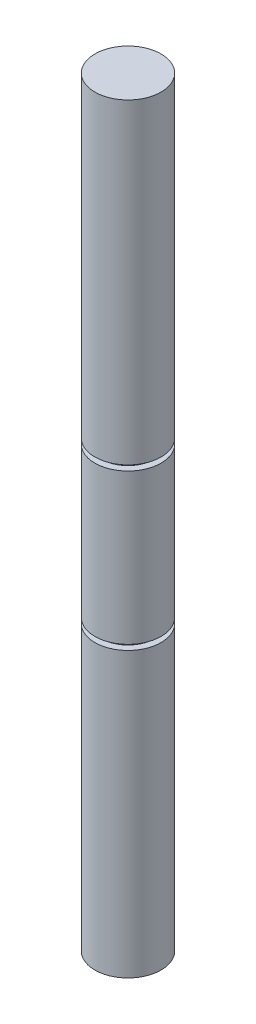
ISO-10303-21;
HEADER;
FILE_DESCRIPTION(('STEP AP214'),'2;1');
FILE_NAME('part.step','',(''),(''),'','','');
FILE_SCHEMA(('AUTOMOTIVE_DESIGN { 1 0 10303 214 1 1 1 1 }'));
ENDSEC;
DATA;
#1=APPLICATION_CONTEXT('core data for automotive mechanical design processes');
#2=APPLICATION_PROTOCOL_DEFINITION('international standard','automotive_design',2000,#1);
#3=PRODUCT_CONTEXT('',#1,'mechanical');
#4=PRODUCT('Part','Part','',(#3));
#5=PRODUCT_RELATED_PRODUCT_CATEGORY('part','',(#4));
#6=PRODUCT_DEFINITION_FORMATION('','',#4);
#7=PRODUCT_DEFINITION_CONTEXT('part definition',#1,'design');
#8=PRODUCT_DEFINITION('design','',#6,#7);
#9=PRODUCT_DEFINITION_SHAPE('','',#8);
#10=(LENGTH_UNIT() NAMED_UNIT(*) SI_UNIT(.MILLI.,.METRE.));
#11=(NAMED_UNIT(*) PLANE_ANGLE_UNIT() SI_UNIT($,.RADIAN.));
#12=(NAMED_UNIT(*) SI_UNIT($,.STERADIAN.) SOLID_ANGLE_UNIT());
#13=UNCERTAINTY_MEASURE_WITH_UNIT(LENGTH_MEASURE(1.E-05),#10,'distance_accuracy_value','');
#14=(GEOMETRIC_REPRESENTATION_CONTEXT(3) GLOBAL_UNCERTAINTY_ASSIGNED_CONTEXT((#13)) GLOBAL_UNIT_ASSIGNED_CONTEXT((#10,
#11,#12)) REPRESENTATION_CONTEXT('',''));
#15=CARTESIAN_POINT('',(0.,0.,0.));
#16=DIRECTION('',(0.,0.,1.));
#17=DIRECTION('',(1.,0.,0.));
#18=AXIS2_PLACEMENT_3D('',#15,#16,#17);
#19=CARTESIAN_POINT('',(0.,115.,0.));
#20=DIRECTION('',(0.,-1.,0.));
#21=DIRECTION('',(0.,0.,-1.));
#22=AXIS2_PLACEMENT_3D('',#19,#20,#21);
#23=CYLINDRICAL_SURFACE('',#22,5.);
#24=CARTESIAN_POINT('',(0.,66.4,0.));
#25=DIRECTION('',(0.,1.,0.));
#26=DIRECTION('',(0.,0.,1.));
#27=AXIS2_PLACEMENT_3D('',#24,#25,#26);
#28=CIRCLE('',#27,5.);
#29=CARTESIAN_POINT('',(0.,66.4,5.));
#30=VERTEX_POINT('',#29);
#31=EDGE_CURVE('E50',#30,#30,#28,.T.);
#32=ORIENTED_EDGE('',*,*,#31,.F.);
#33=EDGE_LOOP('',(#32));
#34=FACE_BOUND('',#33,.T.);
#35=CARTESIAN_POINT('',(0.,43.7,0.));
#36=DIRECTION('',(0.,1.,0.));
#37=DIRECTION('',(0.,0.,1.));
#38=AXIS2_PLACEMENT_3D('',#35,#36,#37);
#39=CIRCLE('',#38,5.);
#40=CARTESIAN_POINT('',(0.,43.7,5.));
#41=VERTEX_POINT('',#40);
#42=EDGE_CURVE('E79',#41,#41,#39,.T.);
#43=ORIENTED_EDGE('',*,*,#42,.T.);
#44=EDGE_LOOP('',(#43));
#45=FACE_BOUND('',#44,.T.);
#46=ADVANCED_FACE('F37',(#34,#45),#23,.T.);
#47=CARTESIAN_POINT('',(0.,66.4,-5.));
#48=DIRECTION('',(0.,1.,0.));
#49=DIRECTION('',(0.,0.,1.));
#50=AXIS2_PLACEMENT_3D('',#47,#48,#49);
#51=PLANE('',#50);
#52=ORIENTED_EDGE('',*,*,#31,.T.);
#53=EDGE_LOOP('',(#52));
#54=FACE_BOUND('',#53,.T.);
#55=CARTESIAN_POINT('',(0.,66.4,0.));
#56=DIRECTION('',(0.,1.,0.));
#57=DIRECTION('',(0.,0.,1.));
#58=AXIS2_PLACEMENT_3D('',#55,#56,#57);
#59=CIRCLE('',#58,4.);
#60=CARTESIAN_POINT('',(0.,66.4,4.));
#61=VERTEX_POINT('',#60);
#62=EDGE_CURVE('E55',#61,#61,#59,.T.);
#63=ORIENTED_EDGE('',*,*,#62,.F.);
#64=EDGE_LOOP('',(#63));
#65=FACE_BOUND('',#64,.T.);
#66=ADVANCED_FACE('F100',(#54,#65),#51,.T.);
#67=CARTESIAN_POINT('',(0.,115.,0.));
#68=DIRECTION('',(0.,1.,0.));
#69=DIRECTION('',(0.,0.,1.));
#70=AXIS2_PLACEMENT_3D('',#67,#68,#69);
#71=CYLINDRICAL_SURFACE('',#70,4.);
#72=ORIENTED_EDGE('',*,*,#62,.T.);
#73=EDGE_LOOP('',(#72));
#74=FACE_BOUND('',#73,.T.);
#75=CARTESIAN_POINT('',(0.,67.2,0.));
#76=DIRECTION('',(0.,1.,0.));
#77=DIRECTION('',(0.,0.,1.));
#78=AXIS2_PLACEMENT_3D('',#75,#76,#77);
#79=CIRCLE('',#78,4.);
#80=CARTESIAN_POINT('',(0.,67.2,4.));
#81=VERTEX_POINT('',#80);
#82=EDGE_CURVE('E59',#81,#81,#79,.T.);
#83=ORIENTED_EDGE('',*,*,#82,.F.);
#84=EDGE_LOOP('',(#83));
#85=FACE_BOUND('',#84,.T.);
#86=ADVANCED_FACE('F106',(#74,#85),#71,.T.);
#87=CARTESIAN_POINT('',(0.,67.2,-5.));
#88=DIRECTION('',(0.,-1.,0.));
#89=DIRECTION('',(0.,0.,-1.));
#90=AXIS2_PLACEMENT_3D('',#87,#88,#89);
#91=PLANE('',#90);
#92=ORIENTED_EDGE('',*,*,#82,.T.);
#93=EDGE_LOOP('',(#92));
#94=FACE_BOUND('',#93,.T.);
#95=CARTESIAN_POINT('',(0.,67.2,0.));
#96=DIRECTION('',(0.,1.,0.));
#97=DIRECTION('',(0.,0.,1.));
#98=AXIS2_PLACEMENT_3D('',#95,#96,#97);
#99=CIRCLE('',#98,5.);
#100=CARTESIAN_POINT('',(0.,67.2,5.));
#101=VERTEX_POINT('',#100);
#102=EDGE_CURVE('E63',#101,#101,#99,.T.);
#103=ORIENTED_EDGE('',*,*,#102,.F.);
#104=EDGE_LOOP('',(#103));
#105=FACE_BOUND('',#104,.T.);
#106=ADVANCED_FACE('F130',(#94,#105),#91,.T.);
#107=CARTESIAN_POINT('',(0.,115.,0.));
#108=DIRECTION('',(0.,1.,0.));
#109=DIRECTION('',(0.,0.,1.));
#110=AXIS2_PLACEMENT_3D('',#107,#108,#109);
#111=PLANE('',#110);
#112=CARTESIAN_POINT('',(0.,115.,0.));
#113=DIRECTION('',(0.,1.,0.));
#114=DIRECTION('',(0.,0.,1.));
#115=AXIS2_PLACEMENT_3D('',#112,#113,#114);
#116=CIRCLE('',#115,5.);
#117=CARTESIAN_POINT('',(0.,115.,5.));
#118=VERTEX_POINT('',#117);
#119=EDGE_CURVE('E10',#118,#118,#116,.T.);
#120=ORIENTED_EDGE('',*,*,#119,.T.);
#121=EDGE_LOOP('',(#120));
#122=FACE_BOUND('',#121,.T.);
#123=ADVANCED_FACE('F111',(#122),#111,.T.);
#124=ORIENTED_EDGE('',*,*,#119,.F.);
#125=EDGE_LOOP('',(#124));
#126=FACE_BOUND('',#125,.T.);
#127=ORIENTED_EDGE('',*,*,#102,.T.);
#128=EDGE_LOOP('',(#127));
#129=FACE_BOUND('',#128,.T.);
#130=ADVANCED_FACE('F102',(#126,#129),#23,.T.);
#131=CARTESIAN_POINT('',(0.,42.9,-5.));
#132=DIRECTION('',(0.,1.,0.));
#133=DIRECTION('',(0.,0.,1.));
#134=AXIS2_PLACEMENT_3D('',#131,#132,#133);
#135=PLANE('',#134);
#136=CARTESIAN_POINT('',(0.,42.9,0.));
#137=DIRECTION('',(0.,1.,0.));
#138=DIRECTION('',(0.,0.,1.));
#139=AXIS2_PLACEMENT_3D('',#136,#137,#138);
#140=CIRCLE('',#139,5.);
#141=CARTESIAN_POINT('',(0.,42.9,5.));
#142=VERTEX_POINT('',#141);
#143=EDGE_CURVE('E67',#142,#142,#140,.T.);
#144=ORIENTED_EDGE('',*,*,#143,.T.);
#145=EDGE_LOOP('',(#144));
#146=FACE_BOUND('',#145,.T.);
#147=CARTESIAN_POINT('',(0.,42.9,0.));
#148=DIRECTION('',(0.,1.,0.));
#149=DIRECTION('',(0.,0.,1.));
#150=AXIS2_PLACEMENT_3D('',#147,#148,#149);
#151=CIRCLE('',#150,4.);
#152=CARTESIAN_POINT('',(0.,42.9,4.));
#153=VERTEX_POINT('',#152);
#154=EDGE_CURVE('E71',#153,#153,#151,.T.);
#155=ORIENTED_EDGE('',*,*,#154,.F.);
#156=EDGE_LOOP('',(#155));
#157=FACE_BOUND('',#156,.T.);
#158=ADVANCED_FACE('F96',(#146,#157),#135,.T.);
#159=CARTESIAN_POINT('',(0.,91.5,0.));
#160=DIRECTION('',(0.,1.,0.));
#161=DIRECTION('',(0.,0.,1.));
#162=AXIS2_PLACEMENT_3D('',#159,#160,#161);
#163=CYLINDRICAL_SURFACE('',#162,4.);
#164=ORIENTED_EDGE('',*,*,#154,.T.);
#165=EDGE_LOOP('',(#164));
#166=FACE_BOUND('',#165,.T.);
#167=CARTESIAN_POINT('',(0.,43.7,0.));
#168=DIRECTION('',(0.,1.,0.));
#169=DIRECTION('',(0.,0.,1.));
#170=AXIS2_PLACEMENT_3D('',#167,#168,#169);
#171=CIRCLE('',#170,4.);
#172=CARTESIAN_POINT('',(0.,43.7,4.));
#173=VERTEX_POINT('',#172);
#174=EDGE_CURVE('E75',#173,#173,#171,.T.);
#175=ORIENTED_EDGE('',*,*,#174,.F.);
#176=EDGE_LOOP('',(#175));
#177=FACE_BOUND('',#176,.T.);
#178=ADVANCED_FACE('F88',(#166,#177),#163,.T.);
#179=CARTESIAN_POINT('',(0.,43.7,-5.));
#180=DIRECTION('',(0.,-1.,0.));
#181=DIRECTION('',(0.,0.,-1.));
#182=AXIS2_PLACEMENT_3D('',#179,#180,#181);
#183=PLANE('',#182);
#184=ORIENTED_EDGE('',*,*,#174,.T.);
#185=EDGE_LOOP('',(#184));
#186=FACE_BOUND('',#185,.T.);
#187=ORIENTED_EDGE('',*,*,#42,.F.);
#188=EDGE_LOOP('',(#187));
#189=FACE_BOUND('',#188,.T.);
#190=ADVANCED_FACE('F85',(#186,#189),#183,.T.);
#191=CARTESIAN_POINT('',(0.,0.,0.));
#192=DIRECTION('',(0.,1.,0.));
#193=DIRECTION('',(0.,0.,1.));
#194=AXIS2_PLACEMENT_3D('',#191,#192,#193);
#195=PLANE('',#194);
#196=CARTESIAN_POINT('',(0.,0.,0.));
#197=DIRECTION('',(0.,1.,0.));
#198=DIRECTION('',(0.,0.,1.));
#199=AXIS2_PLACEMENT_3D('',#196,#197,#198);
#200=CIRCLE('',#199,5.);
#201=CARTESIAN_POINT('',(0.,0.,5.));
#202=VERTEX_POINT('',#201);
#203=EDGE_CURVE('E41',#202,#202,#200,.T.);
#204=ORIENTED_EDGE('',*,*,#203,.F.);
#205=EDGE_LOOP('',(#204));
#206=FACE_BOUND('',#205,.T.);
#207=ADVANCED_FACE('F87',(#206),#195,.F.);
#208=ORIENTED_EDGE('',*,*,#203,.T.);
#209=EDGE_LOOP('',(#208));
#210=FACE_BOUND('',#209,.T.);
#211=ORIENTED_EDGE('',*,*,#143,.F.);
#212=EDGE_LOOP('',(#211));
#213=FACE_BOUND('',#212,.T.);
#214=ADVANCED_FACE('F39',(#210,#213),#23,.T.);
#215=CLOSED_SHELL('',(#46,#66,#86,#106,#123,#130,#158,#178,#190,#207,#214));
#216=MANIFOLD_SOLID_BREP('B2',#215);
#217=ADVANCED_BREP_SHAPE_REPRESENTATION('',(#18,#216),#14);
#218=SHAPE_DEFINITION_REPRESENTATION(#9,#217);
ENDSEC;
END-ISO-10303-21;
